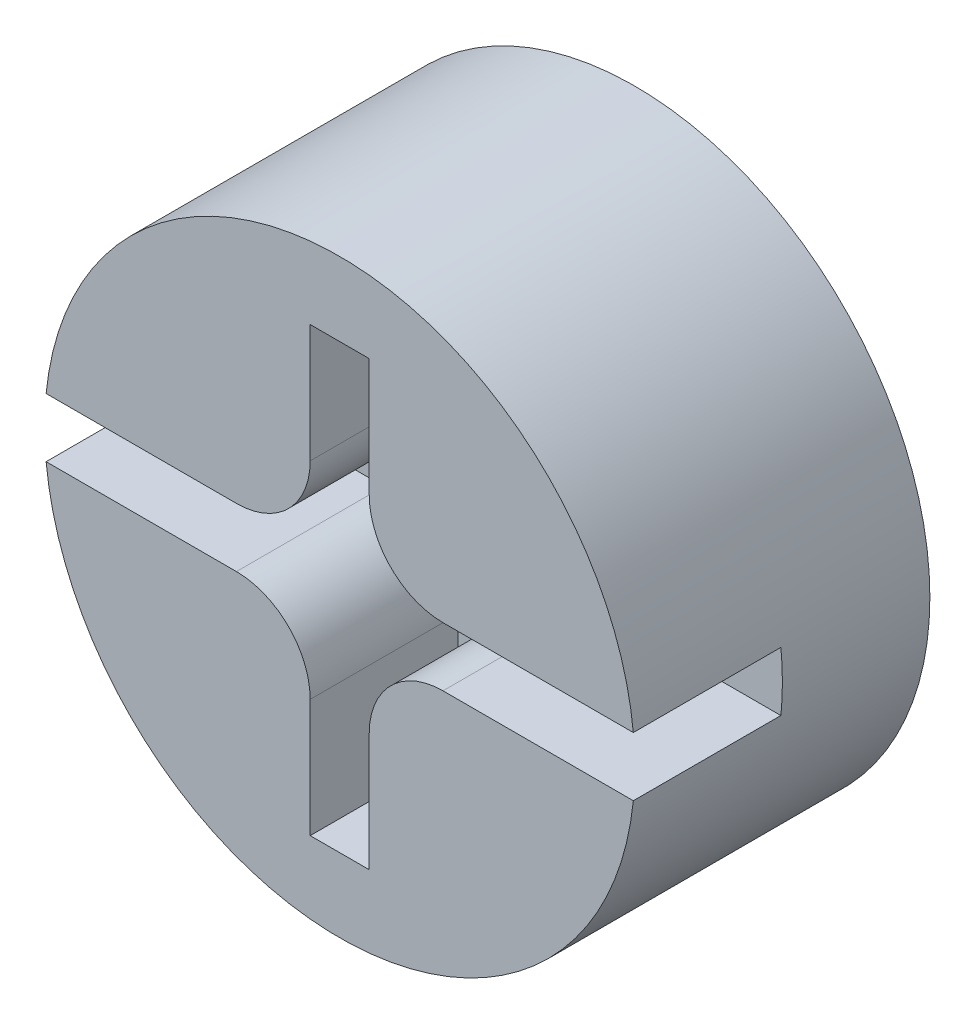
ISO-10303-21;
HEADER;
FILE_DESCRIPTION(('STEP AP214'),'2;1');
FILE_NAME('part.step','',(''),(''),'','','');
FILE_SCHEMA(('AUTOMOTIVE_DESIGN { 1 0 10303 214 1 1 1 1 }'));
ENDSEC;
DATA;
#1=APPLICATION_CONTEXT('core data for automotive mechanical design processes');
#2=APPLICATION_PROTOCOL_DEFINITION('international standard','automotive_design',2000,#1);
#3=PRODUCT_CONTEXT('',#1,'mechanical');
#4=PRODUCT('Part','Part','',(#3));
#5=PRODUCT_RELATED_PRODUCT_CATEGORY('part','',(#4));
#6=PRODUCT_DEFINITION_FORMATION('','',#4);
#7=PRODUCT_DEFINITION_CONTEXT('part definition',#1,'design');
#8=PRODUCT_DEFINITION('design','',#6,#7);
#9=PRODUCT_DEFINITION_SHAPE('','',#8);
#10=(LENGTH_UNIT() NAMED_UNIT(*) SI_UNIT(.MILLI.,.METRE.));
#11=(NAMED_UNIT(*) PLANE_ANGLE_UNIT() SI_UNIT($,.RADIAN.));
#12=(NAMED_UNIT(*) SI_UNIT($,.STERADIAN.) SOLID_ANGLE_UNIT());
#13=UNCERTAINTY_MEASURE_WITH_UNIT(LENGTH_MEASURE(1.E-05),#10,'distance_accuracy_value','');
#14=(GEOMETRIC_REPRESENTATION_CONTEXT(3) GLOBAL_UNCERTAINTY_ASSIGNED_CONTEXT((#13)) GLOBAL_UNIT_ASSIGNED_CONTEXT((#10,
#11,#12)) REPRESENTATION_CONTEXT('',''));
#15=CARTESIAN_POINT('',(0.,0.,0.));
#16=DIRECTION('',(0.,0.,1.));
#17=DIRECTION('',(1.,0.,0.));
#18=AXIS2_PLACEMENT_3D('',#15,#16,#17);
#19=CARTESIAN_POINT('',(-1.98997487421324,-0.2,2.));
#20=DIRECTION('',(0.,-1.,0.));
#21=DIRECTION('',(1.,0.,0.));
#22=AXIS2_PLACEMENT_3D('',#19,#20,#21);
#23=PLANE('',#22);
#24=DIRECTION('',(-1.,0.,0.));
#25=VECTOR('',#24,1.);
#26=CARTESIAN_POINT('',(-1.98997487421324,-0.2,2.));
#27=LINE('',#26,#25);
#28=CARTESIAN_POINT('',(-0.699999999999999,-0.2,2.));
#29=VERTEX_POINT('',#28);
#30=CARTESIAN_POINT('',(-1.98997487421324,-0.2,2.));
#31=VERTEX_POINT('',#30);
#32=EDGE_CURVE('E182',#29,#31,#27,.T.);
#33=ORIENTED_EDGE('',*,*,#32,.F.);
#34=DIRECTION('',(0.,0.,1.));
#35=VECTOR('',#34,1.);
#36=CARTESIAN_POINT('',(-0.699999999999999,-0.2,2.));
#37=LINE('',#36,#35);
#38=CARTESIAN_POINT('',(-0.699999999999999,-0.2,1.));
#39=VERTEX_POINT('',#38);
#40=EDGE_CURVE('E49',#29,#39,#37,.F.);
#41=ORIENTED_EDGE('',*,*,#40,.T.);
#42=DIRECTION('',(-1.,0.,0.));
#43=VECTOR('',#42,1.);
#44=CARTESIAN_POINT('',(-1.98997487421324,-0.2,1.));
#45=LINE('',#44,#43);
#46=CARTESIAN_POINT('',(-1.98997487421324,-0.2,1.));
#47=VERTEX_POINT('',#46);
#48=EDGE_CURVE('E177',#39,#47,#45,.T.);
#49=ORIENTED_EDGE('',*,*,#48,.T.);
#50=DIRECTION('',(0.,0.,-1.));
#51=VECTOR('',#50,1.);
#52=CARTESIAN_POINT('',(-1.98997487421324,-0.2,2.));
#53=LINE('',#52,#51);
#54=EDGE_CURVE('E187',#31,#47,#53,.T.);
#55=ORIENTED_EDGE('',*,*,#54,.F.);
#56=EDGE_LOOP('',(#33,#41,#49,#55));
#57=FACE_BOUND('',#56,.T.);
#58=ADVANCED_FACE('F34',(#57),#23,.F.);
#59=CARTESIAN_POINT('',(0.,0.,1.));
#60=DIRECTION('',(0.,0.,1.));
#61=DIRECTION('',(1.,0.,0.));
#62=AXIS2_PLACEMENT_3D('',#59,#60,#61);
#63=PLANE('',#62);
#64=CARTESIAN_POINT('',(0.,0.,1.));
#65=DIRECTION('',(0.,0.,1.));
#66=DIRECTION('',(1.,0.,0.));
#67=AXIS2_PLACEMENT_3D('',#64,#65,#66);
#68=CIRCLE('',#67,2.);
#69=CARTESIAN_POINT('',(-1.98997487421324,0.2,1.));
#70=VERTEX_POINT('',#69);
#71=EDGE_CURVE('E219',#70,#47,#68,.T.);
#72=ORIENTED_EDGE('',*,*,#71,.T.);
#73=ORIENTED_EDGE('',*,*,#48,.F.);
#74=CARTESIAN_POINT('',(-0.699999999999999,-0.7,1.));
#75=DIRECTION('',(0.,0.,1.));
#76=DIRECTION('',(1.,0.,0.));
#77=AXIS2_PLACEMENT_3D('',#74,#75,#76);
#78=CIRCLE('',#77,0.5);
#79=CARTESIAN_POINT('',(-0.199999999999999,-0.7,1.));
#80=VERTEX_POINT('',#79);
#81=EDGE_CURVE('E11',#39,#80,#78,.F.);
#82=ORIENTED_EDGE('',*,*,#81,.T.);
#83=DIRECTION('',(0.,-1.,0.));
#84=VECTOR('',#83,1.);
#85=CARTESIAN_POINT('',(-0.199999999999999,-0.2,1.));
#86=LINE('',#85,#84);
#87=CARTESIAN_POINT('',(-0.199999999999999,-1.5,1.));
#88=VERTEX_POINT('',#87);
#89=EDGE_CURVE('E144',#80,#88,#86,.T.);
#90=ORIENTED_EDGE('',*,*,#89,.T.);
#91=DIRECTION('',(1.,0.,0.));
#92=VECTOR('',#91,1.);
#93=CARTESIAN_POINT('',(-0.199999999999999,-1.5,1.));
#94=LINE('',#93,#92);
#95=CARTESIAN_POINT('',(0.200000000000001,-1.5,1.));
#96=VERTEX_POINT('',#95);
#97=EDGE_CURVE('E150',#88,#96,#94,.T.);
#98=ORIENTED_EDGE('',*,*,#97,.T.);
#99=DIRECTION('',(0.,1.,0.));
#100=VECTOR('',#99,1.);
#101=CARTESIAN_POINT('',(0.200000000000001,-1.5,1.));
#102=LINE('',#101,#100);
#103=CARTESIAN_POINT('',(0.2,-0.7,1.));
#104=VERTEX_POINT('',#103);
#105=EDGE_CURVE('E165',#96,#104,#102,.T.);
#106=ORIENTED_EDGE('',*,*,#105,.T.);
#107=CARTESIAN_POINT('',(0.7,-0.7,1.));
#108=DIRECTION('',(0.,0.,1.));
#109=DIRECTION('',(1.,0.,0.));
#110=AXIS2_PLACEMENT_3D('',#107,#108,#109);
#111=CIRCLE('',#110,0.5);
#112=CARTESIAN_POINT('',(0.7,-0.2,1.));
#113=VERTEX_POINT('',#112);
#114=EDGE_CURVE('E42',#104,#113,#111,.F.);
#115=ORIENTED_EDGE('',*,*,#114,.T.);
#116=CARTESIAN_POINT('',(1.98997487421324,-0.2,1.));
#117=VERTEX_POINT('',#116);
#118=EDGE_CURVE('E183',#117,#113,#45,.T.);
#119=ORIENTED_EDGE('',*,*,#118,.F.);
#120=CARTESIAN_POINT('',(1.98997487421324,0.2,1.));
#121=VERTEX_POINT('',#120);
#122=EDGE_CURVE('E222',#117,#121,#68,.T.);
#123=ORIENTED_EDGE('',*,*,#122,.T.);
#124=DIRECTION('',(-1.,0.,0.));
#125=VECTOR('',#124,1.);
#126=CARTESIAN_POINT('',(1.98997487421324,0.2,1.));
#127=LINE('',#126,#125);
#128=CARTESIAN_POINT('',(0.7,0.2,1.));
#129=VERTEX_POINT('',#128);
#130=EDGE_CURVE('E223',#121,#129,#127,.T.);
#131=ORIENTED_EDGE('',*,*,#130,.T.);
#132=CARTESIAN_POINT('',(0.7,0.7,1.));
#133=DIRECTION('',(0.,0.,1.));
#134=DIRECTION('',(1.,0.,0.));
#135=AXIS2_PLACEMENT_3D('',#132,#133,#134);
#136=CIRCLE('',#135,0.5);
#137=CARTESIAN_POINT('',(0.2,0.7,1.));
#138=VERTEX_POINT('',#137);
#139=EDGE_CURVE('E266',#129,#138,#136,.F.);
#140=ORIENTED_EDGE('',*,*,#139,.T.);
#141=DIRECTION('',(0.,-1.,0.));
#142=VECTOR('',#141,1.);
#143=CARTESIAN_POINT('',(0.2,1.5,1.));
#144=LINE('',#143,#142);
#145=CARTESIAN_POINT('',(0.2,1.5,1.));
#146=VERTEX_POINT('',#145);
#147=EDGE_CURVE('E214',#146,#138,#144,.T.);
#148=ORIENTED_EDGE('',*,*,#147,.F.);
#149=DIRECTION('',(1.,0.,0.));
#150=VECTOR('',#149,1.);
#151=CARTESIAN_POINT('',(-0.2,1.5,1.));
#152=LINE('',#151,#150);
#153=CARTESIAN_POINT('',(-0.2,1.5,1.));
#154=VERTEX_POINT('',#153);
#155=EDGE_CURVE('E197',#154,#146,#152,.T.);
#156=ORIENTED_EDGE('',*,*,#155,.F.);
#157=DIRECTION('',(0.,-1.,0.));
#158=VECTOR('',#157,1.);
#159=CARTESIAN_POINT('',(-0.2,1.5,1.));
#160=LINE('',#159,#158);
#161=CARTESIAN_POINT('',(-0.2,0.7,1.));
#162=VERTEX_POINT('',#161);
#163=EDGE_CURVE('E206',#154,#162,#160,.T.);
#164=ORIENTED_EDGE('',*,*,#163,.T.);
#165=CARTESIAN_POINT('',(-0.7,0.7,1.));
#166=DIRECTION('',(0.,0.,1.));
#167=DIRECTION('',(1.,0.,0.));
#168=AXIS2_PLACEMENT_3D('',#165,#166,#167);
#169=CIRCLE('',#168,0.5);
#170=CARTESIAN_POINT('',(-0.7,0.2,1.));
#171=VERTEX_POINT('',#170);
#172=EDGE_CURVE('E268',#162,#171,#169,.F.);
#173=ORIENTED_EDGE('',*,*,#172,.T.);
#174=EDGE_CURVE('E221',#171,#70,#127,.T.);
#175=ORIENTED_EDGE('',*,*,#174,.T.);
#176=EDGE_LOOP('',(#72,#73,#82,#90,#98,#106,#115,#119,#123,#131,#140,#148,#156,#164,#173,#175));
#177=FACE_BOUND('',#176,.T.);
#178=ADVANCED_FACE('F147',(#177),#63,.T.);
#179=CARTESIAN_POINT('',(1.98997487421324,0.2,1.));
#180=DIRECTION('',(0.,1.,0.));
#181=DIRECTION('',(-1.,0.,0.));
#182=AXIS2_PLACEMENT_3D('',#179,#180,#181);
#183=PLANE('',#182);
#184=ORIENTED_EDGE('',*,*,#174,.F.);
#185=DIRECTION('',(0.,0.,-1.));
#186=VECTOR('',#185,1.);
#187=CARTESIAN_POINT('',(-0.7,0.2,1.));
#188=LINE('',#187,#186);
#189=CARTESIAN_POINT('',(-0.7,0.2,2.));
#190=VERTEX_POINT('',#189);
#191=EDGE_CURVE('E252',#171,#190,#188,.F.);
#192=ORIENTED_EDGE('',*,*,#191,.T.);
#193=DIRECTION('',(-1.,0.,0.));
#194=VECTOR('',#193,1.);
#195=CARTESIAN_POINT('',(1.98997487421324,0.2,2.));
#196=LINE('',#195,#194);
#197=CARTESIAN_POINT('',(-1.98997487421324,0.2,2.));
#198=VERTEX_POINT('',#197);
#199=EDGE_CURVE('E210',#190,#198,#196,.T.);
#200=ORIENTED_EDGE('',*,*,#199,.T.);
#201=DIRECTION('',(0.,0.,1.));
#202=VECTOR('',#201,1.);
#203=CARTESIAN_POINT('',(-1.98997487421324,0.2,1.));
#204=LINE('',#203,#202);
#205=EDGE_CURVE('E230',#70,#198,#204,.T.);
#206=ORIENTED_EDGE('',*,*,#205,.F.);
#207=EDGE_LOOP('',(#184,#192,#200,#206));
#208=FACE_BOUND('',#207,.T.);
#209=ADVANCED_FACE('F297',(#208),#183,.F.);
#210=CARTESIAN_POINT('',(0.,0.,0.));
#211=DIRECTION('',(0.,0.,1.));
#212=DIRECTION('',(1.,0.,0.));
#213=AXIS2_PLACEMENT_3D('',#210,#211,#212);
#214=CYLINDRICAL_SURFACE('',#213,2.);
#215=ORIENTED_EDGE('',*,*,#205,.T.);
#216=CARTESIAN_POINT('',(0.,0.,2.));
#217=DIRECTION('',(0.,0.,1.));
#218=DIRECTION('',(1.,0.,0.));
#219=AXIS2_PLACEMENT_3D('',#216,#217,#218);
#220=CIRCLE('',#219,2.);
#221=CARTESIAN_POINT('',(1.98997487421324,0.2,2.));
#222=VERTEX_POINT('',#221);
#223=EDGE_CURVE('E233',#222,#198,#220,.T.);
#224=ORIENTED_EDGE('',*,*,#223,.F.);
#225=DIRECTION('',(0.,0.,1.));
#226=VECTOR('',#225,1.);
#227=CARTESIAN_POINT('',(1.98997487421324,0.2,1.));
#228=LINE('',#227,#226);
#229=EDGE_CURVE('E226',#121,#222,#228,.T.);
#230=ORIENTED_EDGE('',*,*,#229,.F.);
#231=ORIENTED_EDGE('',*,*,#122,.F.);
#232=DIRECTION('',(0.,0.,-1.));
#233=VECTOR('',#232,1.);
#234=CARTESIAN_POINT('',(1.98997487421324,-0.2,2.));
#235=LINE('',#234,#233);
#236=CARTESIAN_POINT('',(1.98997487421324,-0.2,2.));
#237=VERTEX_POINT('',#236);
#238=EDGE_CURVE('E192',#237,#117,#235,.T.);
#239=ORIENTED_EDGE('',*,*,#238,.F.);
#240=CARTESIAN_POINT('',(0.,0.,2.));
#241=DIRECTION('',(0.,0.,1.));
#242=DIRECTION('',(-1.,0.,0.));
#243=AXIS2_PLACEMENT_3D('',#240,#241,#242);
#244=CIRCLE('',#243,2.);
#245=EDGE_CURVE('E179',#31,#237,#244,.T.);
#246=ORIENTED_EDGE('',*,*,#245,.F.);
#247=ORIENTED_EDGE('',*,*,#54,.T.);
#248=ORIENTED_EDGE('',*,*,#71,.F.);
#249=EDGE_LOOP('',(#215,#224,#230,#231,#239,#246,#247,#248));
#250=FACE_BOUND('',#249,.T.);
#251=CARTESIAN_POINT('',(0.,0.,0.));
#252=DIRECTION('',(0.,0.,1.));
#253=DIRECTION('',(1.,0.,0.));
#254=AXIS2_PLACEMENT_3D('',#251,#252,#253);
#255=CIRCLE('',#254,2.);
#256=CARTESIAN_POINT('',(2.,0.,0.));
#257=VERTEX_POINT('',#256);
#258=EDGE_CURVE('E237',#257,#257,#255,.T.);
#259=ORIENTED_EDGE('',*,*,#258,.T.);
#260=EDGE_LOOP('',(#259));
#261=FACE_BOUND('',#260,.T.);
#262=ADVANCED_FACE('F330',(#250,#261),#214,.T.);
#263=CARTESIAN_POINT('',(2.,0.,0.));
#264=DIRECTION('',(0.,0.,-1.));
#265=DIRECTION('',(-1.,0.,0.));
#266=AXIS2_PLACEMENT_3D('',#263,#264,#265);
#267=PLANE('',#266);
#268=ORIENTED_EDGE('',*,*,#258,.F.);
#269=EDGE_LOOP('',(#268));
#270=FACE_BOUND('',#269,.T.);
#271=ADVANCED_FACE('F326',(#270),#267,.T.);
#272=CARTESIAN_POINT('',(0.,0.,2.));
#273=DIRECTION('',(0.,0.,1.));
#274=DIRECTION('',(1.,0.,0.));
#275=AXIS2_PLACEMENT_3D('',#272,#273,#274);
#276=PLANE('',#275);
#277=DIRECTION('',(0.,-1.,0.));
#278=VECTOR('',#277,1.);
#279=CARTESIAN_POINT('',(0.2,1.5,2.));
#280=LINE('',#279,#278);
#281=CARTESIAN_POINT('',(0.2,1.5,2.));
#282=VERTEX_POINT('',#281);
#283=CARTESIAN_POINT('',(0.2,0.7,2.));
#284=VERTEX_POINT('',#283);
#285=EDGE_CURVE('E211',#282,#284,#280,.T.);
#286=ORIENTED_EDGE('',*,*,#285,.T.);
#287=CARTESIAN_POINT('',(0.7,0.7,2.));
#288=DIRECTION('',(0.,0.,1.));
#289=DIRECTION('',(1.,0.,0.));
#290=AXIS2_PLACEMENT_3D('',#287,#288,#289);
#291=CIRCLE('',#290,0.5);
#292=CARTESIAN_POINT('',(0.7,0.2,2.));
#293=VERTEX_POINT('',#292);
#294=EDGE_CURVE('E245',#284,#293,#291,.T.);
#295=ORIENTED_EDGE('',*,*,#294,.T.);
#296=EDGE_CURVE('E227',#222,#293,#196,.T.);
#297=ORIENTED_EDGE('',*,*,#296,.F.);
#298=ORIENTED_EDGE('',*,*,#223,.T.);
#299=ORIENTED_EDGE('',*,*,#199,.F.);
#300=CARTESIAN_POINT('',(-0.7,0.7,2.));
#301=DIRECTION('',(0.,0.,1.));
#302=DIRECTION('',(1.,0.,0.));
#303=AXIS2_PLACEMENT_3D('',#300,#301,#302);
#304=CIRCLE('',#303,0.5);
#305=CARTESIAN_POINT('',(-0.2,0.7,2.));
#306=VERTEX_POINT('',#305);
#307=EDGE_CURVE('E243',#190,#306,#304,.T.);
#308=ORIENTED_EDGE('',*,*,#307,.T.);
#309=DIRECTION('',(0.,-1.,0.));
#310=VECTOR('',#309,1.);
#311=CARTESIAN_POINT('',(-0.2,1.5,2.));
#312=LINE('',#311,#310);
#313=CARTESIAN_POINT('',(-0.2,1.5,2.));
#314=VERTEX_POINT('',#313);
#315=EDGE_CURVE('E207',#314,#306,#312,.T.);
#316=ORIENTED_EDGE('',*,*,#315,.F.);
#317=DIRECTION('',(-1.,0.,0.));
#318=VECTOR('',#317,1.);
#319=CARTESIAN_POINT('',(0.2,1.5,2.));
#320=LINE('',#319,#318);
#321=EDGE_CURVE('E203',#282,#314,#320,.T.);
#322=ORIENTED_EDGE('',*,*,#321,.F.);
#323=EDGE_LOOP('',(#286,#295,#297,#298,#299,#308,#316,#322));
#324=FACE_BOUND('',#323,.T.);
#325=ADVANCED_FACE('F322',(#324),#276,.T.);
#326=ORIENTED_EDGE('',*,*,#296,.T.);
#327=DIRECTION('',(0.,0.,1.));
#328=VECTOR('',#327,1.);
#329=CARTESIAN_POINT('',(0.7,0.2,1.));
#330=LINE('',#329,#328);
#331=EDGE_CURVE('E247',#293,#129,#330,.F.);
#332=ORIENTED_EDGE('',*,*,#331,.T.);
#333=ORIENTED_EDGE('',*,*,#130,.F.);
#334=ORIENTED_EDGE('',*,*,#229,.T.);
#335=EDGE_LOOP('',(#326,#332,#333,#334));
#336=FACE_BOUND('',#335,.T.);
#337=ADVANCED_FACE('F317',(#336),#183,.F.);
#338=CARTESIAN_POINT('',(-0.2,1.5,2.));
#339=DIRECTION('',(-1.,0.,0.));
#340=DIRECTION('',(0.,0.,1.));
#341=AXIS2_PLACEMENT_3D('',#338,#339,#340);
#342=PLANE('',#341);
#343=ORIENTED_EDGE('',*,*,#315,.T.);
#344=DIRECTION('',(0.,0.,-1.));
#345=VECTOR('',#344,1.);
#346=CARTESIAN_POINT('',(-0.2,0.7,2.));
#347=LINE('',#346,#345);
#348=EDGE_CURVE('E249',#306,#162,#347,.T.);
#349=ORIENTED_EDGE('',*,*,#348,.T.);
#350=ORIENTED_EDGE('',*,*,#163,.F.);
#351=DIRECTION('',(0.,0.,-1.));
#352=VECTOR('',#351,1.);
#353=CARTESIAN_POINT('',(-0.2,1.5,2.));
#354=LINE('',#353,#352);
#355=EDGE_CURVE('E194',#314,#154,#354,.T.);
#356=ORIENTED_EDGE('',*,*,#355,.F.);
#357=EDGE_LOOP('',(#343,#349,#350,#356));
#358=FACE_BOUND('',#357,.T.);
#359=ADVANCED_FACE('F312',(#358),#342,.F.);
#360=CARTESIAN_POINT('',(0.2,1.5,1.));
#361=DIRECTION('',(1.,0.,0.));
#362=DIRECTION('',(0.,1.,0.));
#363=AXIS2_PLACEMENT_3D('',#360,#361,#362);
#364=PLANE('',#363);
#365=ORIENTED_EDGE('',*,*,#147,.T.);
#366=DIRECTION('',(0.,0.,1.));
#367=VECTOR('',#366,1.);
#368=CARTESIAN_POINT('',(0.2,0.7,1.));
#369=LINE('',#368,#367);
#370=EDGE_CURVE('E240',#138,#284,#369,.T.);
#371=ORIENTED_EDGE('',*,*,#370,.T.);
#372=ORIENTED_EDGE('',*,*,#285,.F.);
#373=DIRECTION('',(0.,0.,1.));
#374=VECTOR('',#373,1.);
#375=CARTESIAN_POINT('',(0.2,1.5,1.));
#376=LINE('',#375,#374);
#377=EDGE_CURVE('E200',#146,#282,#376,.T.);
#378=ORIENTED_EDGE('',*,*,#377,.F.);
#379=EDGE_LOOP('',(#365,#371,#372,#378));
#380=FACE_BOUND('',#379,.T.);
#381=ADVANCED_FACE('F307',(#380),#364,.F.);
#382=CARTESIAN_POINT('',(0.,1.5,0.));
#383=DIRECTION('',(0.,-1.,0.));
#384=DIRECTION('',(0.,0.,-1.));
#385=AXIS2_PLACEMENT_3D('',#382,#383,#384);
#386=PLANE('',#385);
#387=ORIENTED_EDGE('',*,*,#355,.T.);
#388=ORIENTED_EDGE('',*,*,#155,.T.);
#389=ORIENTED_EDGE('',*,*,#377,.T.);
#390=ORIENTED_EDGE('',*,*,#321,.T.);
#391=EDGE_LOOP('',(#387,#388,#389,#390));
#392=FACE_BOUND('',#391,.T.);
#393=ADVANCED_FACE('F302',(#392),#386,.T.);
#394=ORIENTED_EDGE('',*,*,#118,.T.);
#395=DIRECTION('',(0.,0.,1.));
#396=VECTOR('',#395,1.);
#397=CARTESIAN_POINT('',(0.7,-0.2,2.));
#398=LINE('',#397,#396);
#399=CARTESIAN_POINT('',(0.7,-0.2,2.));
#400=VERTEX_POINT('',#399);
#401=EDGE_CURVE('E254',#113,#400,#398,.T.);
#402=ORIENTED_EDGE('',*,*,#401,.T.);
#403=EDGE_CURVE('E184',#237,#400,#27,.T.);
#404=ORIENTED_EDGE('',*,*,#403,.F.);
#405=ORIENTED_EDGE('',*,*,#238,.T.);
#406=EDGE_LOOP('',(#394,#402,#404,#405));
#407=FACE_BOUND('',#406,.T.);
#408=ADVANCED_FACE('F276',(#407),#23,.F.);
#409=CARTESIAN_POINT('',(0.,0.,2.));
#410=DIRECTION('',(0.,0.,-1.));
#411=DIRECTION('',(-1.,0.,0.));
#412=AXIS2_PLACEMENT_3D('',#409,#410,#411);
#413=PLANE('',#412);
#414=ORIENTED_EDGE('',*,*,#403,.T.);
#415=CARTESIAN_POINT('',(0.7,-0.7,2.));
#416=DIRECTION('',(0.,0.,-1.));
#417=DIRECTION('',(-1.,0.,0.));
#418=AXIS2_PLACEMENT_3D('',#415,#416,#417);
#419=CIRCLE('',#418,0.5);
#420=CARTESIAN_POINT('',(0.2,-0.7,2.));
#421=VERTEX_POINT('',#420);
#422=EDGE_CURVE('E259',#400,#421,#419,.F.);
#423=ORIENTED_EDGE('',*,*,#422,.T.);
#424=DIRECTION('',(0.,1.,0.));
#425=VECTOR('',#424,1.);
#426=CARTESIAN_POINT('',(0.200000000000001,-1.5,2.));
#427=LINE('',#426,#425);
#428=CARTESIAN_POINT('',(0.200000000000001,-1.5,2.));
#429=VERTEX_POINT('',#428);
#430=EDGE_CURVE('E154',#429,#421,#427,.T.);
#431=ORIENTED_EDGE('',*,*,#430,.F.);
#432=DIRECTION('',(1.,0.,0.));
#433=VECTOR('',#432,1.);
#434=CARTESIAN_POINT('',(-0.199999999999999,-1.5,2.));
#435=LINE('',#434,#433);
#436=CARTESIAN_POINT('',(-0.199999999999999,-1.5,2.));
#437=VERTEX_POINT('',#436);
#438=EDGE_CURVE('E173',#437,#429,#435,.T.);
#439=ORIENTED_EDGE('',*,*,#438,.F.);
#440=DIRECTION('',(0.,-1.,0.));
#441=VECTOR('',#440,1.);
#442=CARTESIAN_POINT('',(-0.199999999999999,-0.2,2.));
#443=LINE('',#442,#441);
#444=CARTESIAN_POINT('',(-0.199999999999999,-0.7,2.));
#445=VERTEX_POINT('',#444);
#446=EDGE_CURVE('E160',#445,#437,#443,.T.);
#447=ORIENTED_EDGE('',*,*,#446,.F.);
#448=CARTESIAN_POINT('',(-0.699999999999999,-0.7,2.));
#449=DIRECTION('',(0.,0.,-1.));
#450=DIRECTION('',(-1.,0.,0.));
#451=AXIS2_PLACEMENT_3D('',#448,#449,#450);
#452=CIRCLE('',#451,0.5);
#453=EDGE_CURVE('E257',#445,#29,#452,.F.);
#454=ORIENTED_EDGE('',*,*,#453,.T.);
#455=ORIENTED_EDGE('',*,*,#32,.T.);
#456=ORIENTED_EDGE('',*,*,#245,.T.);
#457=EDGE_LOOP('',(#414,#423,#431,#439,#447,#454,#455,#456));
#458=FACE_BOUND('',#457,.T.);
#459=ADVANCED_FACE('F281',(#458),#413,.F.);
#460=CARTESIAN_POINT('',(-0.199999999999999,-0.2,1.));
#461=DIRECTION('',(-1.,0.,0.));
#462=DIRECTION('',(0.,-1.,0.));
#463=AXIS2_PLACEMENT_3D('',#460,#461,#462);
#464=PLANE('',#463);
#465=ORIENTED_EDGE('',*,*,#89,.F.);
#466=DIRECTION('',(0.,0.,1.));
#467=VECTOR('',#466,1.);
#468=CARTESIAN_POINT('',(-0.199999999999999,-0.7,1.));
#469=LINE('',#468,#467);
#470=EDGE_CURVE('E263',#80,#445,#469,.T.);
#471=ORIENTED_EDGE('',*,*,#470,.T.);
#472=ORIENTED_EDGE('',*,*,#446,.T.);
#473=DIRECTION('',(0.,0.,1.));
#474=VECTOR('',#473,1.);
#475=CARTESIAN_POINT('',(-0.199999999999999,-1.5,1.));
#476=LINE('',#475,#474);
#477=EDGE_CURVE('E157',#88,#437,#476,.T.);
#478=ORIENTED_EDGE('',*,*,#477,.F.);
#479=EDGE_LOOP('',(#465,#471,#472,#478));
#480=FACE_BOUND('',#479,.T.);
#481=ADVANCED_FACE('F158',(#480),#464,.F.);
#482=CARTESIAN_POINT('',(0.200000000000001,-1.5,1.));
#483=DIRECTION('',(1.,0.,0.));
#484=DIRECTION('',(0.,1.,0.));
#485=AXIS2_PLACEMENT_3D('',#482,#483,#484);
#486=PLANE('',#485);
#487=ORIENTED_EDGE('',*,*,#430,.T.);
#488=DIRECTION('',(0.,0.,1.));
#489=VECTOR('',#488,1.);
#490=CARTESIAN_POINT('',(0.2,-0.7,1.));
#491=LINE('',#490,#489);
#492=EDGE_CURVE('E261',#421,#104,#491,.F.);
#493=ORIENTED_EDGE('',*,*,#492,.T.);
#494=ORIENTED_EDGE('',*,*,#105,.F.);
#495=DIRECTION('',(0.,0.,1.));
#496=VECTOR('',#495,1.);
#497=CARTESIAN_POINT('',(0.200000000000001,-1.5,1.));
#498=LINE('',#497,#496);
#499=EDGE_CURVE('E164',#96,#429,#498,.T.);
#500=ORIENTED_EDGE('',*,*,#499,.T.);
#501=EDGE_LOOP('',(#487,#493,#494,#500));
#502=FACE_BOUND('',#501,.T.);
#503=ADVANCED_FACE('F283',(#502),#486,.F.);
#504=CARTESIAN_POINT('',(-0.199999999999999,-1.5,1.));
#505=DIRECTION('',(0.,-1.,0.));
#506=DIRECTION('',(0.,0.,-1.));
#507=AXIS2_PLACEMENT_3D('',#504,#505,#506);
#508=PLANE('',#507);
#509=ORIENTED_EDGE('',*,*,#438,.T.);
#510=ORIENTED_EDGE('',*,*,#499,.F.);
#511=ORIENTED_EDGE('',*,*,#97,.F.);
#512=ORIENTED_EDGE('',*,*,#477,.T.);
#513=EDGE_LOOP('',(#509,#510,#511,#512));
#514=FACE_BOUND('',#513,.T.);
#515=ADVANCED_FACE('F167',(#514),#508,.F.);
#516=CARTESIAN_POINT('',(0.7,0.7,1.));
#517=DIRECTION('',(0.,0.,1.));
#518=DIRECTION('',(1.,0.,0.));
#519=AXIS2_PLACEMENT_3D('',#516,#517,#518);
#520=CYLINDRICAL_SURFACE('',#519,0.5);
#521=ORIENTED_EDGE('',*,*,#139,.F.);
#522=ORIENTED_EDGE('',*,*,#331,.F.);
#523=ORIENTED_EDGE('',*,*,#294,.F.);
#524=ORIENTED_EDGE('',*,*,#370,.F.);
#525=EDGE_LOOP('',(#521,#522,#523,#524));
#526=FACE_BOUND('',#525,.T.);
#527=ADVANCED_FACE('F335',(#526),#520,.T.);
#528=CARTESIAN_POINT('',(-0.7,0.7,2.));
#529=DIRECTION('',(0.,0.,-1.));
#530=DIRECTION('',(-1.,0.,0.));
#531=AXIS2_PLACEMENT_3D('',#528,#529,#530);
#532=CYLINDRICAL_SURFACE('',#531,0.5);
#533=ORIENTED_EDGE('',*,*,#307,.F.);
#534=ORIENTED_EDGE('',*,*,#191,.F.);
#535=ORIENTED_EDGE('',*,*,#172,.F.);
#536=ORIENTED_EDGE('',*,*,#348,.F.);
#537=EDGE_LOOP('',(#533,#534,#535,#536));
#538=FACE_BOUND('',#537,.T.);
#539=ADVANCED_FACE('F291',(#538),#532,.T.);
#540=CARTESIAN_POINT('',(0.7,-0.7,2.));
#541=DIRECTION('',(0.,0.,1.));
#542=DIRECTION('',(1.,0.,0.));
#543=AXIS2_PLACEMENT_3D('',#540,#541,#542);
#544=CYLINDRICAL_SURFACE('',#543,0.5);
#545=ORIENTED_EDGE('',*,*,#114,.F.);
#546=ORIENTED_EDGE('',*,*,#492,.F.);
#547=ORIENTED_EDGE('',*,*,#422,.F.);
#548=ORIENTED_EDGE('',*,*,#401,.F.);
#549=EDGE_LOOP('',(#545,#546,#547,#548));
#550=FACE_BOUND('',#549,.T.);
#551=ADVANCED_FACE('F278',(#550),#544,.T.);
#552=CARTESIAN_POINT('',(-0.699999999999999,-0.7,1.));
#553=DIRECTION('',(0.,0.,1.));
#554=DIRECTION('',(1.,0.,0.));
#555=AXIS2_PLACEMENT_3D('',#552,#553,#554);
#556=CYLINDRICAL_SURFACE('',#555,0.5);
#557=ORIENTED_EDGE('',*,*,#81,.F.);
#558=ORIENTED_EDGE('',*,*,#40,.F.);
#559=ORIENTED_EDGE('',*,*,#453,.F.);
#560=ORIENTED_EDGE('',*,*,#470,.F.);
#561=EDGE_LOOP('',(#557,#558,#559,#560));
#562=FACE_BOUND('',#561,.T.);
#563=ADVANCED_FACE('F36',(#562),#556,.T.);
#564=CLOSED_SHELL('',(#58,#178,#209,#262,#271,#325,#337,#359,#381,#393,#408,#459,#481,#503,#515,
#527,#539,#551,#563));
#565=MANIFOLD_SOLID_BREP('B2',#564);
#566=ADVANCED_BREP_SHAPE_REPRESENTATION('',(#18,#565),#14);
#567=SHAPE_DEFINITION_REPRESENTATION(#9,#566);
ENDSEC;
END-ISO-10303-21;
